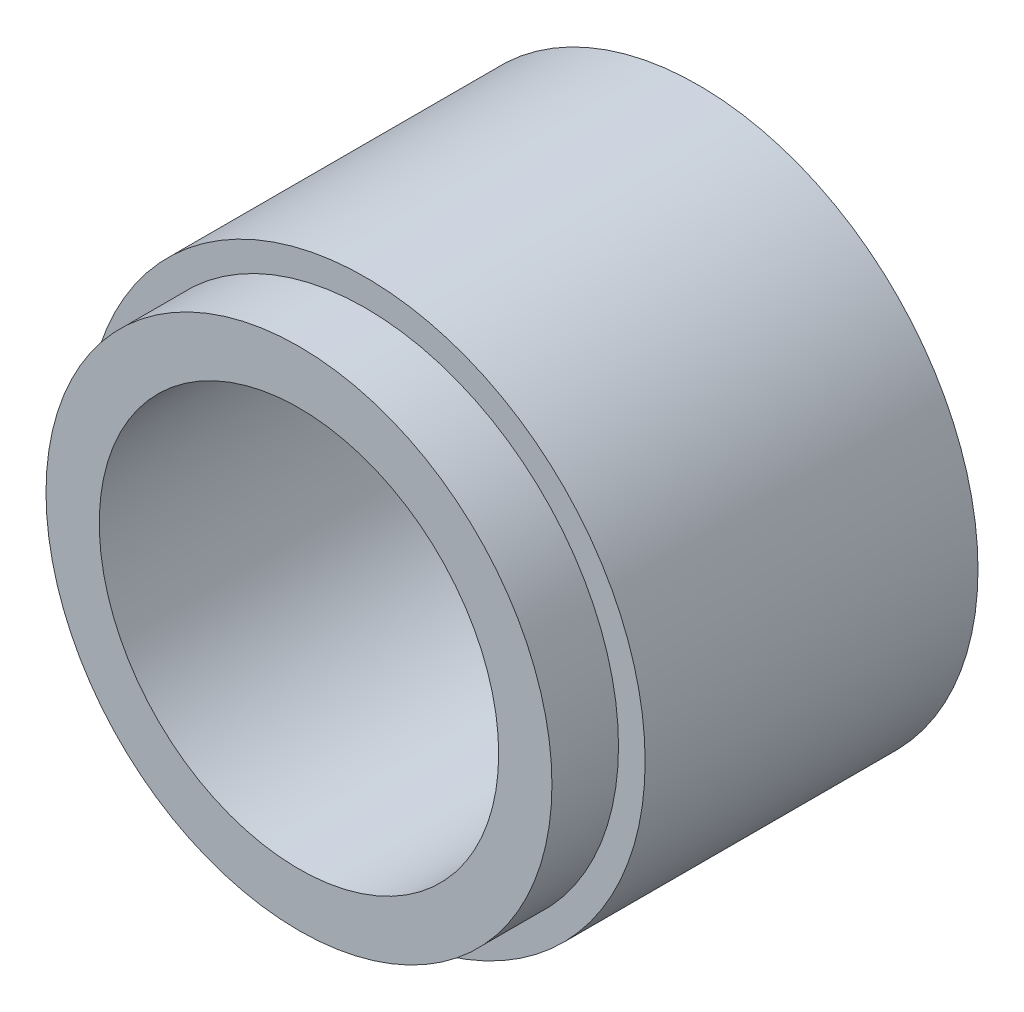
ISO-10303-21;
HEADER;
FILE_DESCRIPTION(('STEP AP214'),'2;1');
FILE_NAME('part.step','',(''),(''),'','','');
FILE_SCHEMA(('AUTOMOTIVE_DESIGN { 1 0 10303 214 1 1 1 1 }'));
ENDSEC;
DATA;
#1=APPLICATION_CONTEXT('core data for automotive mechanical design processes');
#2=APPLICATION_PROTOCOL_DEFINITION('international standard','automotive_design',2000,#1);
#3=PRODUCT_CONTEXT('',#1,'mechanical');
#4=PRODUCT('Part','Part','',(#3));
#5=PRODUCT_RELATED_PRODUCT_CATEGORY('part','',(#4));
#6=PRODUCT_DEFINITION_FORMATION('','',#4);
#7=PRODUCT_DEFINITION_CONTEXT('part definition',#1,'design');
#8=PRODUCT_DEFINITION('design','',#6,#7);
#9=PRODUCT_DEFINITION_SHAPE('','',#8);
#10=(LENGTH_UNIT() NAMED_UNIT(*) SI_UNIT(.MILLI.,.METRE.));
#11=(NAMED_UNIT(*) PLANE_ANGLE_UNIT() SI_UNIT($,.RADIAN.));
#12=(NAMED_UNIT(*) SI_UNIT($,.STERADIAN.) SOLID_ANGLE_UNIT());
#13=UNCERTAINTY_MEASURE_WITH_UNIT(LENGTH_MEASURE(1.E-05),#10,'distance_accuracy_value','');
#14=(GEOMETRIC_REPRESENTATION_CONTEXT(3) GLOBAL_UNCERTAINTY_ASSIGNED_CONTEXT((#13)) GLOBAL_UNIT_ASSIGNED_CONTEXT((#10,
#11,#12)) REPRESENTATION_CONTEXT('',''));
#15=CARTESIAN_POINT('',(0.,0.,0.));
#16=DIRECTION('',(0.,0.,1.));
#17=DIRECTION('',(1.,0.,0.));
#18=AXIS2_PLACEMENT_3D('',#15,#16,#17);
#19=CARTESIAN_POINT('',(0.,0.,3.));
#20=DIRECTION('',(0.,0.,1.));
#21=DIRECTION('',(1.,0.,0.));
#22=AXIS2_PLACEMENT_3D('',#19,#20,#21);
#23=PLANE('',#22);
#24=CARTESIAN_POINT('',(0.,0.,3.));
#25=DIRECTION('',(0.,0.,1.));
#26=DIRECTION('',(1.,0.,0.));
#27=AXIS2_PLACEMENT_3D('',#24,#25,#26);
#28=CIRCLE('',#27,1.5);
#29=CARTESIAN_POINT('',(1.5,0.,3.));
#30=VERTEX_POINT('',#29);
#31=EDGE_CURVE('E48',#30,#30,#28,.T.);
#32=ORIENTED_EDGE('',*,*,#31,.F.);
#33=EDGE_LOOP('',(#32));
#34=FACE_BOUND('',#33,.T.);
#35=CARTESIAN_POINT('',(0.,0.,3.));
#36=DIRECTION('',(0.,0.,1.));
#37=DIRECTION('',(1.,0.,0.));
#38=AXIS2_PLACEMENT_3D('',#35,#36,#37);
#39=CIRCLE('',#38,1.9);
#40=CARTESIAN_POINT('',(1.9,0.,3.));
#41=VERTEX_POINT('',#40);
#42=EDGE_CURVE('E62',#41,#41,#39,.T.);
#43=ORIENTED_EDGE('',*,*,#42,.T.);
#44=EDGE_LOOP('',(#43));
#45=FACE_BOUND('',#44,.T.);
#46=ADVANCED_FACE('F41',(#34,#45),#23,.T.);
#47=CARTESIAN_POINT('',(0.,0.,3.));
#48=DIRECTION('',(0.,0.,-1.));
#49=DIRECTION('',(-1.,0.,0.));
#50=AXIS2_PLACEMENT_3D('',#47,#48,#49);
#51=CYLINDRICAL_SURFACE('',#50,2.1);
#52=CARTESIAN_POINT('',(0.,0.,0.));
#53=DIRECTION('',(0.,0.,1.));
#54=DIRECTION('',(1.,0.,0.));
#55=AXIS2_PLACEMENT_3D('',#52,#53,#54);
#56=CIRCLE('',#55,2.1);
#57=CARTESIAN_POINT('',(2.1,0.,0.));
#58=VERTEX_POINT('',#57);
#59=EDGE_CURVE('E10',#58,#58,#56,.T.);
#60=ORIENTED_EDGE('',*,*,#59,.T.);
#61=EDGE_LOOP('',(#60));
#62=FACE_BOUND('',#61,.T.);
#63=CARTESIAN_POINT('',(0.,0.,2.5));
#64=DIRECTION('',(0.,0.,1.));
#65=DIRECTION('',(1.,0.,0.));
#66=AXIS2_PLACEMENT_3D('',#63,#64,#65);
#67=CIRCLE('',#66,2.1);
#68=CARTESIAN_POINT('',(2.1,0.,2.5));
#69=VERTEX_POINT('',#68);
#70=EDGE_CURVE('E57',#69,#69,#67,.T.);
#71=ORIENTED_EDGE('',*,*,#70,.F.);
#72=EDGE_LOOP('',(#71));
#73=FACE_BOUND('',#72,.T.);
#74=ADVANCED_FACE('F43',(#62,#73),#51,.T.);
#75=CARTESIAN_POINT('',(0.,0.,0.));
#76=DIRECTION('',(0.,0.,1.));
#77=DIRECTION('',(1.,0.,0.));
#78=AXIS2_PLACEMENT_3D('',#75,#76,#77);
#79=PLANE('',#78);
#80=ORIENTED_EDGE('',*,*,#59,.F.);
#81=EDGE_LOOP('',(#80));
#82=FACE_BOUND('',#81,.T.);
#83=CARTESIAN_POINT('',(0.,0.,0.));
#84=DIRECTION('',(0.,0.,1.));
#85=DIRECTION('',(1.,0.,0.));
#86=AXIS2_PLACEMENT_3D('',#83,#84,#85);
#87=CIRCLE('',#86,1.5);
#88=CARTESIAN_POINT('',(1.5,0.,0.));
#89=VERTEX_POINT('',#88);
#90=EDGE_CURVE('E52',#89,#89,#87,.T.);
#91=ORIENTED_EDGE('',*,*,#90,.T.);
#92=EDGE_LOOP('',(#91));
#93=FACE_BOUND('',#92,.T.);
#94=ADVANCED_FACE('F79',(#82,#93),#79,.F.);
#95=CARTESIAN_POINT('',(0.,0.,3.));
#96=DIRECTION('',(0.,0.,-1.));
#97=DIRECTION('',(-1.,0.,0.));
#98=AXIS2_PLACEMENT_3D('',#95,#96,#97);
#99=CYLINDRICAL_SURFACE('',#98,1.5);
#100=ORIENTED_EDGE('',*,*,#31,.T.);
#101=EDGE_LOOP('',(#100));
#102=FACE_BOUND('',#101,.T.);
#103=ORIENTED_EDGE('',*,*,#90,.F.);
#104=EDGE_LOOP('',(#103));
#105=FACE_BOUND('',#104,.T.);
#106=ADVANCED_FACE('F74',(#102,#105),#99,.F.);
#107=CARTESIAN_POINT('',(0.,0.,2.5));
#108=DIRECTION('',(0.,0.,1.));
#109=DIRECTION('',(1.,0.,0.));
#110=AXIS2_PLACEMENT_3D('',#107,#108,#109);
#111=PLANE('',#110);
#112=CARTESIAN_POINT('',(0.,0.,2.5));
#113=DIRECTION('',(0.,0.,1.));
#114=DIRECTION('',(1.,0.,0.));
#115=AXIS2_PLACEMENT_3D('',#112,#113,#114);
#116=CIRCLE('',#115,1.9);
#117=CARTESIAN_POINT('',(1.9,0.,2.5));
#118=VERTEX_POINT('',#117);
#119=EDGE_CURVE('E61',#118,#118,#116,.T.);
#120=ORIENTED_EDGE('',*,*,#119,.F.);
#121=EDGE_LOOP('',(#120));
#122=FACE_BOUND('',#121,.T.);
#123=ORIENTED_EDGE('',*,*,#70,.T.);
#124=EDGE_LOOP('',(#123));
#125=FACE_BOUND('',#124,.T.);
#126=ADVANCED_FACE('F71',(#122,#125),#111,.T.);
#127=CARTESIAN_POINT('',(0.,0.,2.5));
#128=DIRECTION('',(0.,0.,1.));
#129=DIRECTION('',(1.,0.,0.));
#130=AXIS2_PLACEMENT_3D('',#127,#128,#129);
#131=CYLINDRICAL_SURFACE('',#130,1.9);
#132=ORIENTED_EDGE('',*,*,#119,.T.);
#133=EDGE_LOOP('',(#132));
#134=FACE_BOUND('',#133,.T.);
#135=ORIENTED_EDGE('',*,*,#42,.F.);
#136=EDGE_LOOP('',(#135));
#137=FACE_BOUND('',#136,.T.);
#138=ADVANCED_FACE('F68',(#134,#137),#131,.T.);
#139=CLOSED_SHELL('',(#46,#74,#94,#106,#126,#138));
#140=MANIFOLD_SOLID_BREP('B2',#139);
#141=ADVANCED_BREP_SHAPE_REPRESENTATION('',(#18,#140),#14);
#142=SHAPE_DEFINITION_REPRESENTATION(#9,#141);
ENDSEC;
END-ISO-10303-21;
